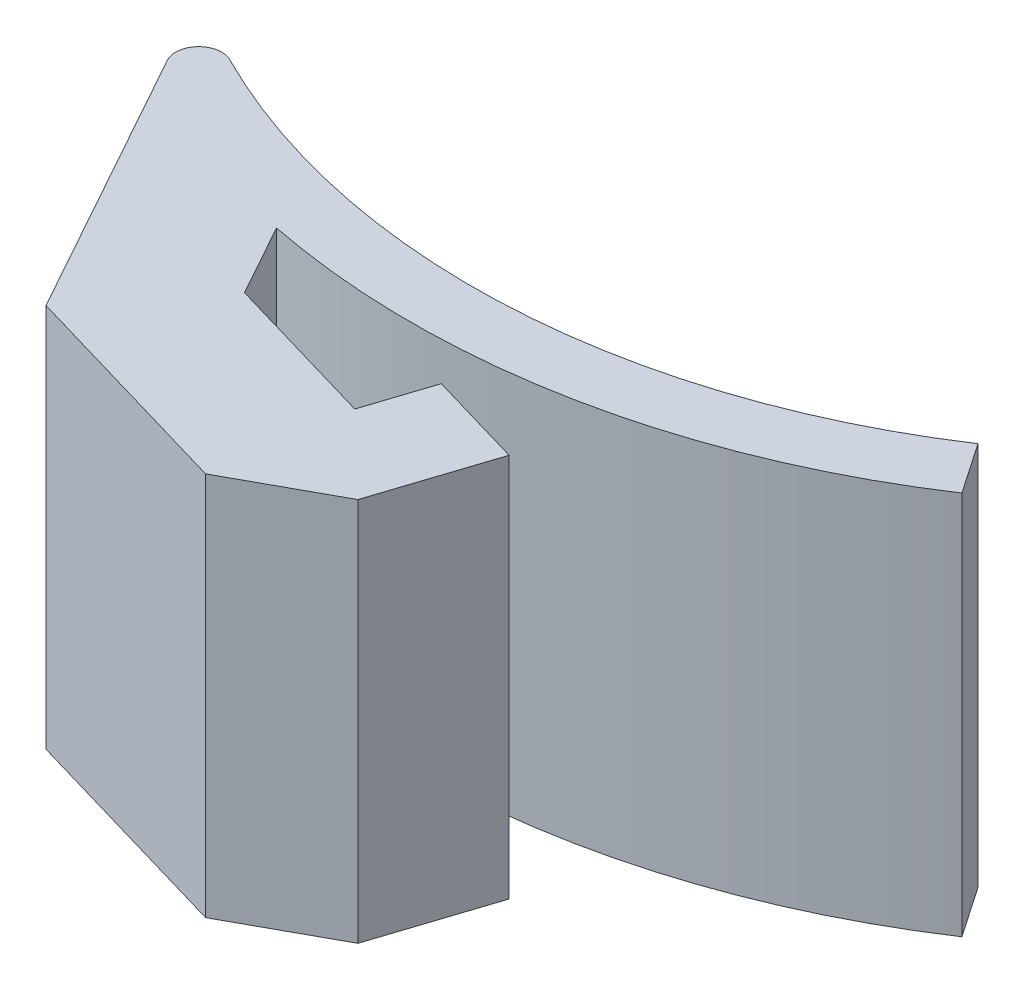
ISO-10303-21;
HEADER;
FILE_DESCRIPTION(('STEP AP214'),'2;1');
FILE_NAME('part.step','',(''),(''),'','','');
FILE_SCHEMA(('AUTOMOTIVE_DESIGN { 1 0 10303 214 1 1 1 1 }'));
ENDSEC;
DATA;
#1=APPLICATION_CONTEXT('core data for automotive mechanical design processes');
#2=APPLICATION_PROTOCOL_DEFINITION('international standard','automotive_design',2000,#1);
#3=PRODUCT_CONTEXT('',#1,'mechanical');
#4=PRODUCT('Part','Part','',(#3));
#5=PRODUCT_RELATED_PRODUCT_CATEGORY('part','',(#4));
#6=PRODUCT_DEFINITION_FORMATION('','',#4);
#7=PRODUCT_DEFINITION_CONTEXT('part definition',#1,'design');
#8=PRODUCT_DEFINITION('design','',#6,#7);
#9=PRODUCT_DEFINITION_SHAPE('','',#8);
#10=(LENGTH_UNIT() NAMED_UNIT(*) SI_UNIT(.MILLI.,.METRE.));
#11=(NAMED_UNIT(*) PLANE_ANGLE_UNIT() SI_UNIT($,.RADIAN.));
#12=(NAMED_UNIT(*) SI_UNIT($,.STERADIAN.) SOLID_ANGLE_UNIT());
#13=UNCERTAINTY_MEASURE_WITH_UNIT(LENGTH_MEASURE(1.E-05),#10,'distance_accuracy_value','');
#14=(GEOMETRIC_REPRESENTATION_CONTEXT(3) GLOBAL_UNCERTAINTY_ASSIGNED_CONTEXT((#13)) GLOBAL_UNIT_ASSIGNED_CONTEXT((#10,
#11,#12)) REPRESENTATION_CONTEXT('',''));
#15=CARTESIAN_POINT('',(0.,0.,0.));
#16=DIRECTION('',(0.,0.,1.));
#17=DIRECTION('',(1.,0.,0.));
#18=AXIS2_PLACEMENT_3D('',#15,#16,#17);
#19=CARTESIAN_POINT('',(5.05582400857616,5.,-7.67373471098418));
#20=DIRECTION('',(0.,-1.,0.));
#21=DIRECTION('',(0.,0.,-1.));
#22=AXIS2_PLACEMENT_3D('',#19,#20,#21);
#23=CYLINDRICAL_SURFACE('',#22,9.18953539741039);
#24=CARTESIAN_POINT('',(5.05582400857616,0.,-7.67373471098418));
#25=DIRECTION('',(0.,-1.,0.));
#26=DIRECTION('',(0.,0.,1.));
#27=AXIS2_PLACEMENT_3D('',#24,#25,#26);
#28=CIRCLE('',#27,9.18953539741039);
#29=CARTESIAN_POINT('',(10.1199985009644,0.,-0.00550821909555573));
#30=VERTEX_POINT('',#29);
#31=CARTESIAN_POINT('',(0.923871938285659,0.,0.534464416052189));
#32=VERTEX_POINT('',#31);
#33=EDGE_CURVE('E149',#30,#32,#28,.T.);
#34=ORIENTED_EDGE('',*,*,#33,.T.);
#35=DIRECTION('',(0.,-1.,0.));
#36=VECTOR('',#35,1.);
#37=CARTESIAN_POINT('',(0.923871938285659,5.,0.534464416052189));
#38=LINE('',#37,#36);
#39=CARTESIAN_POINT('',(0.923871938285659,5.,0.534464416052189));
#40=VERTEX_POINT('',#39);
#41=EDGE_CURVE('E130',#40,#32,#38,.T.);
#42=ORIENTED_EDGE('',*,*,#41,.F.);
#43=CARTESIAN_POINT('',(5.05582400857616,5.,-7.67373471098418));
#44=DIRECTION('',(0.,-1.,0.));
#45=DIRECTION('',(0.,0.,1.));
#46=AXIS2_PLACEMENT_3D('',#43,#44,#45);
#47=CIRCLE('',#46,9.18953539741039);
#48=CARTESIAN_POINT('',(10.1199985009644,5.,-0.00550821909555573));
#49=VERTEX_POINT('',#48);
#50=EDGE_CURVE('E137',#49,#40,#47,.T.);
#51=ORIENTED_EDGE('',*,*,#50,.F.);
#52=DIRECTION('',(0.,-1.,0.));
#53=VECTOR('',#52,1.);
#54=CARTESIAN_POINT('',(10.1199985009644,5.,-0.00550821909555573));
#55=LINE('',#54,#53);
#56=EDGE_CURVE('E178',#49,#30,#55,.T.);
#57=ORIENTED_EDGE('',*,*,#56,.T.);
#58=EDGE_LOOP('',(#34,#42,#51,#57));
#59=FACE_BOUND('',#58,.T.);
#60=ADVANCED_FACE('F37',(#59),#23,.F.);
#61=CARTESIAN_POINT('',(0.788980938090321,5.,0.802427880103358));
#62=DIRECTION('',(0.,-1.,0.));
#63=DIRECTION('',(0.,0.,-1.));
#64=AXIS2_PLACEMENT_3D('',#61,#62,#63);
#65=CYLINDRICAL_SURFACE('',#64,0.300000000000001);
#66=CARTESIAN_POINT('',(0.788980938090321,0.,0.802427880103358));
#67=DIRECTION('',(0.,1.,0.));
#68=DIRECTION('',(0.,0.,1.));
#69=AXIS2_PLACEMENT_3D('',#66,#67,#68);
#70=CIRCLE('',#69,0.300000000000001);
#71=CARTESIAN_POINT('',(0.52673375525386,0.,0.948120759456947));
#72=VERTEX_POINT('',#71);
#73=EDGE_CURVE('E197',#32,#72,#70,.T.);
#74=ORIENTED_EDGE('',*,*,#73,.T.);
#75=DIRECTION('',(0.,-1.,0.));
#76=VECTOR('',#75,1.);
#77=CARTESIAN_POINT('',(0.52673375525386,5.,0.948120759456947));
#78=LINE('',#77,#76);
#79=CARTESIAN_POINT('',(0.52673375525386,5.,0.948120759456947));
#80=VERTEX_POINT('',#79);
#81=EDGE_CURVE('E133',#80,#72,#78,.T.);
#82=ORIENTED_EDGE('',*,*,#81,.F.);
#83=CARTESIAN_POINT('',(0.788980938090321,5.,0.802427880103358));
#84=DIRECTION('',(0.,1.,0.));
#85=DIRECTION('',(0.,0.,1.));
#86=AXIS2_PLACEMENT_3D('',#83,#84,#85);
#87=CIRCLE('',#86,0.300000000000001);
#88=EDGE_CURVE('E126',#40,#80,#87,.T.);
#89=ORIENTED_EDGE('',*,*,#88,.F.);
#90=ORIENTED_EDGE('',*,*,#41,.T.);
#91=EDGE_LOOP('',(#74,#82,#89,#90));
#92=FACE_BOUND('',#91,.T.);
#93=ADVANCED_FACE('F128',(#92),#65,.T.);
#94=CARTESIAN_POINT('',(0.52673375525386,5.,0.948120759456947));
#95=DIRECTION('',(0.874157276121538,0.,-0.485642931178632));
#96=DIRECTION('',(-0.485642931178632,0.,-0.874157276121538));
#97=AXIS2_PLACEMENT_3D('',#94,#95,#96);
#98=PLANE('',#97);
#99=DIRECTION('',(0.485642931178632,0.,0.874157276121538));
#100=VECTOR('',#99,1.);
#101=CARTESIAN_POINT('',(0.52673375525386,0.,0.948120759456947));
#102=LINE('',#101,#100);
#103=CARTESIAN_POINT('',(2.5,0.,4.5));
#104=VERTEX_POINT('',#103);
#105=EDGE_CURVE('E195',#72,#104,#102,.T.);
#106=ORIENTED_EDGE('',*,*,#105,.T.);
#107=DIRECTION('',(0.,-1.,0.));
#108=VECTOR('',#107,1.);
#109=CARTESIAN_POINT('',(2.5,5.,4.5));
#110=LINE('',#109,#108);
#111=CARTESIAN_POINT('',(2.5,5.,4.5));
#112=VERTEX_POINT('',#111);
#113=EDGE_CURVE('E154',#112,#104,#110,.T.);
#114=ORIENTED_EDGE('',*,*,#113,.F.);
#115=DIRECTION('',(0.485642931178632,0.,0.874157276121538));
#116=VECTOR('',#115,1.);
#117=CARTESIAN_POINT('',(0.52673375525386,5.,0.948120759456947));
#118=LINE('',#117,#116);
#119=EDGE_CURVE('E136',#80,#112,#118,.T.);
#120=ORIENTED_EDGE('',*,*,#119,.F.);
#121=ORIENTED_EDGE('',*,*,#81,.T.);
#122=EDGE_LOOP('',(#106,#114,#120,#121));
#123=FACE_BOUND('',#122,.T.);
#124=ADVANCED_FACE('F218',(#123),#98,.F.);
#125=CARTESIAN_POINT('',(2.5,5.,4.5));
#126=DIRECTION('',(0.280894551611551,0.,-0.959738636752187));
#127=DIRECTION('',(-0.959738636752187,0.,-0.280894551611551));
#128=AXIS2_PLACEMENT_3D('',#125,#126,#127);
#129=PLANE('',#128);
#130=DIRECTION('',(0.959738636752187,0.,0.280894551611551));
#131=VECTOR('',#130,1.);
#132=CARTESIAN_POINT('',(2.5,0.,4.5));
#133=LINE('',#132,#131);
#134=CARTESIAN_POINT('',(5.43532461606066,0.,5.35910544838845));
#135=VERTEX_POINT('',#134);
#136=EDGE_CURVE('E193',#104,#135,#133,.T.);
#137=ORIENTED_EDGE('',*,*,#136,.T.);
#138=DIRECTION('',(0.,1.,0.));
#139=VECTOR('',#138,1.);
#140=CARTESIAN_POINT('',(5.43532461606066,5.,5.35910544838845));
#141=LINE('',#140,#139);
#142=CARTESIAN_POINT('',(5.43532461606066,5.,5.35910544838845));
#143=VERTEX_POINT('',#142);
#144=EDGE_CURVE('E45',#135,#143,#141,.T.);
#145=ORIENTED_EDGE('',*,*,#144,.T.);
#146=DIRECTION('',(0.959738636752187,0.,0.280894551611551));
#147=VECTOR('',#146,1.);
#148=CARTESIAN_POINT('',(2.5,5.,4.5));
#149=LINE('',#148,#147);
#150=EDGE_CURVE('E213',#112,#143,#149,.T.);
#151=ORIENTED_EDGE('',*,*,#150,.F.);
#152=ORIENTED_EDGE('',*,*,#113,.T.);
#153=EDGE_LOOP('',(#137,#145,#151,#152));
#154=FACE_BOUND('',#153,.T.);
#155=ADVANCED_FACE('F220',(#154),#129,.F.);
#156=CARTESIAN_POINT('',(6.39506325281285,5.,5.64));
#157=DIRECTION('',(-0.950600369544609,0.,-0.310417360052001));
#158=DIRECTION('',(-0.310417360052001,0.,0.950600369544609));
#159=AXIS2_PLACEMENT_3D('',#156,#157,#158);
#160=PLANE('',#159);
#161=DIRECTION('',(0.310417360052001,0.,-0.950600369544609));
#162=VECTOR('',#161,1.);
#163=CARTESIAN_POINT('',(6.39506325281285,5.,5.64));
#164=LINE('',#163,#162);
#165=CARTESIAN_POINT('',(6.71553662551766,5.,4.6586048020273));
#166=VERTEX_POINT('',#165);
#167=CARTESIAN_POINT('',(7.2,5.,3.17501811494062));
#168=VERTEX_POINT('',#167);
#169=EDGE_CURVE('E211',#166,#168,#164,.T.);
#170=ORIENTED_EDGE('',*,*,#169,.F.);
#171=DIRECTION('',(0.,-1.,0.));
#172=VECTOR('',#171,1.);
#173=CARTESIAN_POINT('',(6.71553662551766,5.,4.6586048020273));
#174=LINE('',#173,#172);
#175=CARTESIAN_POINT('',(6.71553662551766,0.,4.6586048020273));
#176=VERTEX_POINT('',#175);
#177=EDGE_CURVE('E150',#166,#176,#174,.T.);
#178=ORIENTED_EDGE('',*,*,#177,.T.);
#179=DIRECTION('',(0.310417360052001,0.,-0.950600369544609));
#180=VECTOR('',#179,1.);
#181=CARTESIAN_POINT('',(6.39506325281285,0.,5.64));
#182=LINE('',#181,#180);
#183=CARTESIAN_POINT('',(7.2,0.,3.17501811494062));
#184=VERTEX_POINT('',#183);
#185=EDGE_CURVE('E191',#176,#184,#182,.T.);
#186=ORIENTED_EDGE('',*,*,#185,.T.);
#187=DIRECTION('',(0.,-1.,0.));
#188=VECTOR('',#187,1.);
#189=CARTESIAN_POINT('',(7.2,5.,3.17501811494062));
#190=LINE('',#189,#188);
#191=EDGE_CURVE('E160',#168,#184,#190,.T.);
#192=ORIENTED_EDGE('',*,*,#191,.F.);
#193=EDGE_LOOP('',(#170,#178,#186,#192));
#194=FACE_BOUND('',#193,.T.);
#195=ADVANCED_FACE('F222',(#194),#160,.F.);
#196=CARTESIAN_POINT('',(7.2,5.,3.17501811494062));
#197=DIRECTION('',(-0.28089455161155,0.,0.959738636752187));
#198=DIRECTION('',(0.959738636752187,0.,0.28089455161155));
#199=AXIS2_PLACEMENT_3D('',#196,#197,#198);
#200=PLANE('',#199);
#201=DIRECTION('',(-0.959738636752187,0.,-0.28089455161155));
#202=VECTOR('',#201,1.);
#203=CARTESIAN_POINT('',(7.2,0.,3.17501811494062));
#204=LINE('',#203,#202);
#205=CARTESIAN_POINT('',(5.95233977222216,0.,2.8098551978456));
#206=VERTEX_POINT('',#205);
#207=EDGE_CURVE('E189',#184,#206,#204,.T.);
#208=ORIENTED_EDGE('',*,*,#207,.T.);
#209=DIRECTION('',(0.,-1.,0.));
#210=VECTOR('',#209,1.);
#211=CARTESIAN_POINT('',(5.95233977222216,5.,2.8098551978456));
#212=LINE('',#211,#210);
#213=CARTESIAN_POINT('',(5.95233977222216,5.,2.8098551978456));
#214=VERTEX_POINT('',#213);
#215=EDGE_CURVE('E163',#214,#206,#212,.T.);
#216=ORIENTED_EDGE('',*,*,#215,.F.);
#217=DIRECTION('',(-0.959738636752187,0.,-0.28089455161155));
#218=VECTOR('',#217,1.);
#219=CARTESIAN_POINT('',(7.2,5.,3.17501811494062));
#220=LINE('',#219,#218);
#221=EDGE_CURVE('E209',#168,#214,#220,.T.);
#222=ORIENTED_EDGE('',*,*,#221,.F.);
#223=ORIENTED_EDGE('',*,*,#191,.T.);
#224=EDGE_LOOP('',(#208,#216,#222,#223));
#225=FACE_BOUND('',#224,.T.);
#226=ADVANCED_FACE('F228',(#225),#200,.F.);
#227=CARTESIAN_POINT('',(5.95233977222216,5.,2.8098551978456));
#228=DIRECTION('',(0.950600369544609,0.,0.310417360052001));
#229=DIRECTION('',(0.310417360052001,0.,-0.950600369544609));
#230=AXIS2_PLACEMENT_3D('',#227,#228,#229);
#231=PLANE('',#230);
#232=DIRECTION('',(-0.310417360052001,0.,0.950600369544609));
#233=VECTOR('',#232,1.);
#234=CARTESIAN_POINT('',(5.95233977222216,0.,2.8098551978456));
#235=LINE('',#234,#233);
#236=CARTESIAN_POINT('',(5.6753646662996,0.,3.65804435195906));
#237=VERTEX_POINT('',#236);
#238=EDGE_CURVE('E187',#206,#237,#235,.T.);
#239=ORIENTED_EDGE('',*,*,#238,.T.);
#240=DIRECTION('',(0.,-1.,0.));
#241=VECTOR('',#240,1.);
#242=CARTESIAN_POINT('',(5.6753646662996,5.,3.65804435195906));
#243=LINE('',#242,#241);
#244=CARTESIAN_POINT('',(5.6753646662996,5.,3.65804435195906));
#245=VERTEX_POINT('',#244);
#246=EDGE_CURVE('E166',#245,#237,#243,.T.);
#247=ORIENTED_EDGE('',*,*,#246,.F.);
#248=DIRECTION('',(-0.310417360052001,0.,0.950600369544609));
#249=VECTOR('',#248,1.);
#250=CARTESIAN_POINT('',(5.95233977222216,5.,2.8098551978456));
#251=LINE('',#250,#249);
#252=EDGE_CURVE('E207',#214,#245,#251,.T.);
#253=ORIENTED_EDGE('',*,*,#252,.F.);
#254=ORIENTED_EDGE('',*,*,#215,.T.);
#255=EDGE_LOOP('',(#239,#247,#253,#254));
#256=FACE_BOUND('',#255,.T.);
#257=ADVANCED_FACE('F253',(#256),#231,.F.);
#258=CARTESIAN_POINT('',(5.6753646662996,5.,3.65804435195906));
#259=DIRECTION('',(-0.28089455161155,0.,0.959738636752187));
#260=DIRECTION('',(0.959738636752187,0.,0.28089455161155));
#261=AXIS2_PLACEMENT_3D('',#258,#259,#260);
#262=PLANE('',#261);
#263=DIRECTION('',(-0.959738636752187,0.,-0.28089455161155));
#264=VECTOR('',#263,1.);
#265=CARTESIAN_POINT('',(5.6753646662996,0.,3.65804435195906));
#266=LINE('',#265,#264);
#267=CARTESIAN_POINT('',(3.64719938236409,0.,3.06444464031978));
#268=VERTEX_POINT('',#267);
#269=EDGE_CURVE('E185',#237,#268,#266,.T.);
#270=ORIENTED_EDGE('',*,*,#269,.T.);
#271=DIRECTION('',(0.,-1.,0.));
#272=VECTOR('',#271,1.);
#273=CARTESIAN_POINT('',(3.64719938236409,5.,3.06444464031978));
#274=LINE('',#273,#272);
#275=CARTESIAN_POINT('',(3.64719938236409,5.,3.06444464031978));
#276=VERTEX_POINT('',#275);
#277=EDGE_CURVE('E169',#276,#268,#274,.T.);
#278=ORIENTED_EDGE('',*,*,#277,.F.);
#279=DIRECTION('',(-0.959738636752187,0.,-0.28089455161155));
#280=VECTOR('',#279,1.);
#281=CARTESIAN_POINT('',(5.6753646662996,5.,3.65804435195906));
#282=LINE('',#281,#280);
#283=EDGE_CURVE('E205',#245,#276,#282,.T.);
#284=ORIENTED_EDGE('',*,*,#283,.F.);
#285=ORIENTED_EDGE('',*,*,#246,.T.);
#286=EDGE_LOOP('',(#270,#278,#284,#285));
#287=FACE_BOUND('',#286,.T.);
#288=ADVANCED_FACE('F264',(#287),#262,.F.);
#289=CARTESIAN_POINT('',(3.64719938236409,5.,3.06444464031978));
#290=DIRECTION('',(-0.874157276121536,0.,0.485642931178634));
#291=DIRECTION('',(0.485642931178634,0.,0.874157276121536));
#292=AXIS2_PLACEMENT_3D('',#289,#290,#291);
#293=PLANE('',#292);
#294=DIRECTION('',(-0.485642931178634,0.,-0.874157276121537));
#295=VECTOR('',#294,1.);
#296=CARTESIAN_POINT('',(3.64719938236409,0.,3.06444464031978));
#297=LINE('',#296,#295);
#298=CARTESIAN_POINT('',(3.12683362108714,0.,2.12778627002127));
#299=VERTEX_POINT('',#298);
#300=EDGE_CURVE('E183',#268,#299,#297,.T.);
#301=ORIENTED_EDGE('',*,*,#300,.T.);
#302=DIRECTION('',(0.,-1.,0.));
#303=VECTOR('',#302,1.);
#304=CARTESIAN_POINT('',(3.12683362108714,5.,2.12778627002127));
#305=LINE('',#304,#303);
#306=CARTESIAN_POINT('',(3.12683362108714,5.,2.12778627002127));
#307=VERTEX_POINT('',#306);
#308=EDGE_CURVE('E172',#307,#299,#305,.T.);
#309=ORIENTED_EDGE('',*,*,#308,.F.);
#310=DIRECTION('',(-0.485642931178634,0.,-0.874157276121537));
#311=VECTOR('',#310,1.);
#312=CARTESIAN_POINT('',(3.64719938236409,5.,3.06444464031978));
#313=LINE('',#312,#311);
#314=EDGE_CURVE('E203',#276,#307,#313,.T.);
#315=ORIENTED_EDGE('',*,*,#314,.F.);
#316=ORIENTED_EDGE('',*,*,#277,.T.);
#317=EDGE_LOOP('',(#301,#309,#315,#316));
#318=FACE_BOUND('',#317,.T.);
#319=ADVANCED_FACE('F274',(#318),#293,.F.);
#320=CARTESIAN_POINT('',(5.05582400857616,5.,-7.67373471098418));
#321=DIRECTION('',(0.,-1.,0.));
#322=DIRECTION('',(0.,0.,-1.));
#323=AXIS2_PLACEMENT_3D('',#320,#321,#322);
#324=CYLINDRICAL_SURFACE('',#323,9.98953539741039);
#325=CARTESIAN_POINT('',(5.05582400857616,0.,-7.67373471098418));
#326=DIRECTION('',(0.,1.,0.));
#327=DIRECTION('',(0.,0.,1.));
#328=AXIS2_PLACEMENT_3D('',#325,#326,#327);
#329=CIRCLE('',#328,9.98953539741039);
#330=CARTESIAN_POINT('',(10.5711166203741,0.,0.655272724620727));
#331=VERTEX_POINT('',#330);
#332=EDGE_CURVE('E181',#299,#331,#329,.T.);
#333=ORIENTED_EDGE('',*,*,#332,.T.);
#334=DIRECTION('',(0.,-1.,0.));
#335=VECTOR('',#334,1.);
#336=CARTESIAN_POINT('',(10.5711166203741,5.,0.655272724620727));
#337=LINE('',#336,#335);
#338=CARTESIAN_POINT('',(10.5711166203741,5.,0.655272724620727));
#339=VERTEX_POINT('',#338);
#340=EDGE_CURVE('E175',#339,#331,#337,.T.);
#341=ORIENTED_EDGE('',*,*,#340,.F.);
#342=CARTESIAN_POINT('',(5.05582400857616,5.,-7.67373471098418));
#343=DIRECTION('',(0.,1.,0.));
#344=DIRECTION('',(0.,0.,1.));
#345=AXIS2_PLACEMENT_3D('',#342,#343,#344);
#346=CIRCLE('',#345,9.98953539741039);
#347=EDGE_CURVE('E201',#307,#339,#346,.T.);
#348=ORIENTED_EDGE('',*,*,#347,.F.);
#349=ORIENTED_EDGE('',*,*,#308,.T.);
#350=EDGE_LOOP('',(#333,#341,#348,#349));
#351=FACE_BOUND('',#350,.T.);
#352=ADVANCED_FACE('F284',(#351),#324,.T.);
#353=CARTESIAN_POINT('',(10.1199985009644,5.,-0.00550821909555573));
#354=DIRECTION('',(-0.825886489862736,0.,0.563836417644522));
#355=DIRECTION('',(0.563836417644522,0.,0.825886489862736));
#356=AXIS2_PLACEMENT_3D('',#353,#354,#355);
#357=PLANE('',#356);
#358=DIRECTION('',(-0.563836417644522,0.,-0.825886489862736));
#359=VECTOR('',#358,1.);
#360=CARTESIAN_POINT('',(10.1199985009644,0.,-0.00550821909555573));
#361=LINE('',#360,#359);
#362=EDGE_CURVE('E146',#331,#30,#361,.T.);
#363=ORIENTED_EDGE('',*,*,#362,.T.);
#364=ORIENTED_EDGE('',*,*,#56,.F.);
#365=DIRECTION('',(-0.563836417644522,0.,-0.825886489862736));
#366=VECTOR('',#365,1.);
#367=CARTESIAN_POINT('',(10.1199985009644,5.,-0.00550821909555573));
#368=LINE('',#367,#366);
#369=EDGE_CURVE('E142',#339,#49,#368,.T.);
#370=ORIENTED_EDGE('',*,*,#369,.F.);
#371=ORIENTED_EDGE('',*,*,#340,.T.);
#372=EDGE_LOOP('',(#363,#364,#370,#371));
#373=FACE_BOUND('',#372,.T.);
#374=ADVANCED_FACE('F294',(#373),#357,.F.);
#375=CARTESIAN_POINT('',(5.05582400857616,5.,-7.67373471098418));
#376=DIRECTION('',(0.,1.,0.));
#377=DIRECTION('',(0.,0.,1.));
#378=AXIS2_PLACEMENT_3D('',#375,#376,#377);
#379=PLANE('',#378);
#380=ORIENTED_EDGE('',*,*,#150,.T.);
#381=DIRECTION('',(-0.877260140457087,0.,0.48001525597132));
#382=VECTOR('',#381,1.);
#383=CARTESIAN_POINT('',(10.6313727017378,5.,2.51595523916311));
#384=LINE('',#383,#382);
#385=EDGE_CURVE('E11',#143,#166,#384,.F.);
#386=ORIENTED_EDGE('',*,*,#385,.T.);
#387=ORIENTED_EDGE('',*,*,#169,.T.);
#388=ORIENTED_EDGE('',*,*,#221,.T.);
#389=ORIENTED_EDGE('',*,*,#252,.T.);
#390=ORIENTED_EDGE('',*,*,#283,.T.);
#391=ORIENTED_EDGE('',*,*,#314,.T.);
#392=ORIENTED_EDGE('',*,*,#347,.T.);
#393=ORIENTED_EDGE('',*,*,#369,.T.);
#394=ORIENTED_EDGE('',*,*,#50,.T.);
#395=ORIENTED_EDGE('',*,*,#88,.T.);
#396=ORIENTED_EDGE('',*,*,#119,.T.);
#397=EDGE_LOOP('',(#380,#386,#387,#388,#389,#390,#391,#392,#393,#394,#395,#396));
#398=FACE_BOUND('',#397,.T.);
#399=ADVANCED_FACE('F140',(#398),#379,.T.);
#400=CARTESIAN_POINT('',(5.05582400857616,0.,-7.67373471098418));
#401=DIRECTION('',(0.,1.,0.));
#402=DIRECTION('',(0.,0.,1.));
#403=AXIS2_PLACEMENT_3D('',#400,#401,#402);
#404=PLANE('',#403);
#405=ORIENTED_EDGE('',*,*,#185,.F.);
#406=DIRECTION('',(0.877260140457087,0.,-0.48001525597132));
#407=VECTOR('',#406,1.);
#408=CARTESIAN_POINT('',(6.71553662551766,0.,4.6586048020273));
#409=LINE('',#408,#407);
#410=EDGE_CURVE('E59',#176,#135,#409,.F.);
#411=ORIENTED_EDGE('',*,*,#410,.T.);
#412=ORIENTED_EDGE('',*,*,#136,.F.);
#413=ORIENTED_EDGE('',*,*,#105,.F.);
#414=ORIENTED_EDGE('',*,*,#73,.F.);
#415=ORIENTED_EDGE('',*,*,#33,.F.);
#416=ORIENTED_EDGE('',*,*,#362,.F.);
#417=ORIENTED_EDGE('',*,*,#332,.F.);
#418=ORIENTED_EDGE('',*,*,#300,.F.);
#419=ORIENTED_EDGE('',*,*,#269,.F.);
#420=ORIENTED_EDGE('',*,*,#238,.F.);
#421=ORIENTED_EDGE('',*,*,#207,.F.);
#422=EDGE_LOOP('',(#405,#411,#412,#413,#414,#415,#416,#417,#418,#419,#420,#421));
#423=FACE_BOUND('',#422,.T.);
#424=ADVANCED_FACE('F321',(#423),#404,.F.);
#425=CARTESIAN_POINT('',(6.71553662551766,5.,4.6586048020273));
#426=DIRECTION('',(-0.48001525597132,0.,-0.877260140457087));
#427=DIRECTION('',(0.,-1.,0.));
#428=AXIS2_PLACEMENT_3D('',#425,#426,#427);
#429=PLANE('',#428);
#430=ORIENTED_EDGE('',*,*,#385,.F.);
#431=ORIENTED_EDGE('',*,*,#144,.F.);
#432=ORIENTED_EDGE('',*,*,#410,.F.);
#433=ORIENTED_EDGE('',*,*,#177,.F.);
#434=EDGE_LOOP('',(#430,#431,#432,#433));
#435=FACE_BOUND('',#434,.T.);
#436=ADVANCED_FACE('F39',(#435),#429,.F.);
#437=CLOSED_SHELL('',(#60,#93,#124,#155,#195,#226,#257,#288,#319,#352,#374,#399,#424,#436));
#438=MANIFOLD_SOLID_BREP('B2',#437);
#439=ADVANCED_BREP_SHAPE_REPRESENTATION('',(#18,#438),#14);
#440=SHAPE_DEFINITION_REPRESENTATION(#9,#439);
ENDSEC;
END-ISO-10303-21;
